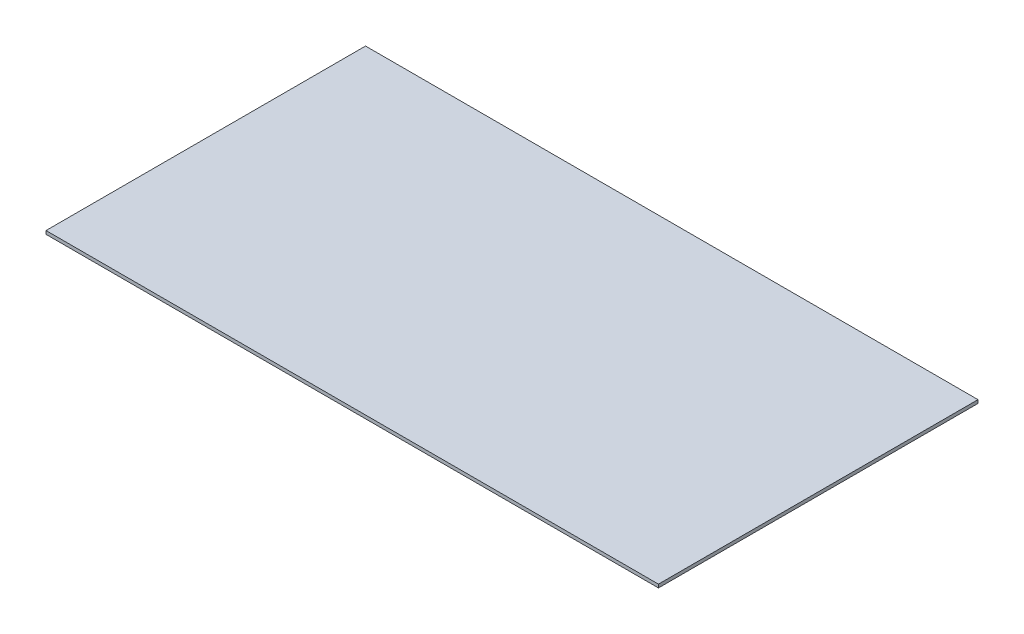
ISO-10303-21;
HEADER;
FILE_DESCRIPTION(('STEP AP214'),'2;1');
FILE_NAME('part.step','',(''),(''),'','','');
FILE_SCHEMA(('AUTOMOTIVE_DESIGN { 1 0 10303 214 1 1 1 1 }'));
ENDSEC;
DATA;
#1=APPLICATION_CONTEXT('core data for automotive mechanical design processes');
#2=APPLICATION_PROTOCOL_DEFINITION('international standard','automotive_design',2000,#1);
#3=PRODUCT_CONTEXT('',#1,'mechanical');
#4=PRODUCT('Part','Part','',(#3));
#5=PRODUCT_RELATED_PRODUCT_CATEGORY('part','',(#4));
#6=PRODUCT_DEFINITION_FORMATION('','',#4);
#7=PRODUCT_DEFINITION_CONTEXT('part definition',#1,'design');
#8=PRODUCT_DEFINITION('design','',#6,#7);
#9=PRODUCT_DEFINITION_SHAPE('','',#8);
#10=(LENGTH_UNIT() NAMED_UNIT(*) SI_UNIT(.MILLI.,.METRE.));
#11=(NAMED_UNIT(*) PLANE_ANGLE_UNIT() SI_UNIT($,.RADIAN.));
#12=(NAMED_UNIT(*) SI_UNIT($,.STERADIAN.) SOLID_ANGLE_UNIT());
#13=UNCERTAINTY_MEASURE_WITH_UNIT(LENGTH_MEASURE(1.E-05),#10,'distance_accuracy_value','');
#14=(GEOMETRIC_REPRESENTATION_CONTEXT(3) GLOBAL_UNCERTAINTY_ASSIGNED_CONTEXT((#13)) GLOBAL_UNIT_ASSIGNED_CONTEXT((#10,
#11,#12)) REPRESENTATION_CONTEXT('',''));
#15=CARTESIAN_POINT('',(0.,0.,0.));
#16=DIRECTION('',(0.,0.,1.));
#17=DIRECTION('',(1.,0.,0.));
#18=AXIS2_PLACEMENT_3D('',#15,#16,#17);
#19=CARTESIAN_POINT('',(584.2,6.35,304.8));
#20=DIRECTION('',(-1.,0.,0.));
#21=DIRECTION('',(0.,0.,1.));
#22=AXIS2_PLACEMENT_3D('',#19,#20,#21);
#23=PLANE('',#22);
#24=DIRECTION('',(0.,0.,-1.));
#25=VECTOR('',#24,1.);
#26=CARTESIAN_POINT('',(584.2,0.,304.8));
#27=LINE('',#26,#25);
#28=CARTESIAN_POINT('',(584.2,0.,304.8));
#29=VERTEX_POINT('',#28);
#30=CARTESIAN_POINT('',(584.2,0.,-304.8));
#31=VERTEX_POINT('',#30);
#32=EDGE_CURVE('E111',#29,#31,#27,.T.);
#33=ORIENTED_EDGE('',*,*,#32,.T.);
#34=DIRECTION('',(0.,-1.,0.));
#35=VECTOR('',#34,1.);
#36=CARTESIAN_POINT('',(584.2,6.35,-304.8));
#37=LINE('',#36,#35);
#38=CARTESIAN_POINT('',(584.2,6.35,-304.8));
#39=VERTEX_POINT('',#38);
#40=EDGE_CURVE('E11',#39,#31,#37,.T.);
#41=ORIENTED_EDGE('',*,*,#40,.F.);
#42=DIRECTION('',(0.,0.,-1.));
#43=VECTOR('',#42,1.);
#44=CARTESIAN_POINT('',(584.2,6.35,304.8));
#45=LINE('',#44,#43);
#46=CARTESIAN_POINT('',(584.2,6.35,304.8));
#47=VERTEX_POINT('',#46);
#48=EDGE_CURVE('E95',#47,#39,#45,.T.);
#49=ORIENTED_EDGE('',*,*,#48,.F.);
#50=DIRECTION('',(0.,-1.,0.));
#51=VECTOR('',#50,1.);
#52=CARTESIAN_POINT('',(584.2,6.35,304.8));
#53=LINE('',#52,#51);
#54=EDGE_CURVE('E107',#47,#29,#53,.T.);
#55=ORIENTED_EDGE('',*,*,#54,.T.);
#56=EDGE_LOOP('',(#33,#41,#49,#55));
#57=FACE_BOUND('',#56,.T.);
#58=ADVANCED_FACE('F43',(#57),#23,.F.);
#59=CARTESIAN_POINT('',(-584.2,6.35,-304.8));
#60=DIRECTION('',(0.,0.,1.));
#61=DIRECTION('',(1.,0.,0.));
#62=AXIS2_PLACEMENT_3D('',#59,#60,#61);
#63=PLANE('',#62);
#64=DIRECTION('',(-1.,0.,0.));
#65=VECTOR('',#64,1.);
#66=CARTESIAN_POINT('',(-584.2,0.,-304.8));
#67=LINE('',#66,#65);
#68=CARTESIAN_POINT('',(-584.2,0.,-304.8));
#69=VERTEX_POINT('',#68);
#70=EDGE_CURVE('E100',#31,#69,#67,.T.);
#71=ORIENTED_EDGE('',*,*,#70,.T.);
#72=DIRECTION('',(0.,-1.,0.));
#73=VECTOR('',#72,1.);
#74=CARTESIAN_POINT('',(-584.2,6.35,-304.8));
#75=LINE('',#74,#73);
#76=CARTESIAN_POINT('',(-584.2,6.35,-304.8));
#77=VERTEX_POINT('',#76);
#78=EDGE_CURVE('E52',#77,#69,#75,.T.);
#79=ORIENTED_EDGE('',*,*,#78,.F.);
#80=DIRECTION('',(-1.,0.,0.));
#81=VECTOR('',#80,1.);
#82=CARTESIAN_POINT('',(-584.2,6.35,-304.8));
#83=LINE('',#82,#81);
#84=EDGE_CURVE('E90',#39,#77,#83,.T.);
#85=ORIENTED_EDGE('',*,*,#84,.F.);
#86=ORIENTED_EDGE('',*,*,#40,.T.);
#87=EDGE_LOOP('',(#71,#79,#85,#86));
#88=FACE_BOUND('',#87,.T.);
#89=ADVANCED_FACE('F99',(#88),#63,.F.);
#90=CARTESIAN_POINT('',(-584.2,6.35,304.8));
#91=DIRECTION('',(1.,0.,0.));
#92=DIRECTION('',(0.,0.,-1.));
#93=AXIS2_PLACEMENT_3D('',#90,#91,#92);
#94=PLANE('',#93);
#95=DIRECTION('',(0.,0.,1.));
#96=VECTOR('',#95,1.);
#97=CARTESIAN_POINT('',(-584.2,0.,304.8));
#98=LINE('',#97,#96);
#99=CARTESIAN_POINT('',(-584.2,0.,304.8));
#100=VERTEX_POINT('',#99);
#101=EDGE_CURVE('E77',#69,#100,#98,.T.);
#102=ORIENTED_EDGE('',*,*,#101,.T.);
#103=DIRECTION('',(0.,-1.,0.));
#104=VECTOR('',#103,1.);
#105=CARTESIAN_POINT('',(-584.2,6.35,304.8));
#106=LINE('',#105,#104);
#107=CARTESIAN_POINT('',(-584.2,6.35,304.8));
#108=VERTEX_POINT('',#107);
#109=EDGE_CURVE('E102',#108,#100,#106,.T.);
#110=ORIENTED_EDGE('',*,*,#109,.F.);
#111=DIRECTION('',(0.,0.,1.));
#112=VECTOR('',#111,1.);
#113=CARTESIAN_POINT('',(-584.2,6.35,304.8));
#114=LINE('',#113,#112);
#115=EDGE_CURVE('E93',#77,#108,#114,.T.);
#116=ORIENTED_EDGE('',*,*,#115,.F.);
#117=ORIENTED_EDGE('',*,*,#78,.T.);
#118=EDGE_LOOP('',(#102,#110,#116,#117));
#119=FACE_BOUND('',#118,.T.);
#120=ADVANCED_FACE('F103',(#119),#94,.F.);
#121=CARTESIAN_POINT('',(-584.2,6.35,304.8));
#122=DIRECTION('',(0.,0.,-1.));
#123=DIRECTION('',(-1.,0.,0.));
#124=AXIS2_PLACEMENT_3D('',#121,#122,#123);
#125=PLANE('',#124);
#126=DIRECTION('',(1.,0.,0.));
#127=VECTOR('',#126,1.);
#128=CARTESIAN_POINT('',(-584.2,0.,304.8));
#129=LINE('',#128,#127);
#130=EDGE_CURVE('E83',#100,#29,#129,.T.);
#131=ORIENTED_EDGE('',*,*,#130,.T.);
#132=ORIENTED_EDGE('',*,*,#54,.F.);
#133=DIRECTION('',(1.,0.,0.));
#134=VECTOR('',#133,1.);
#135=CARTESIAN_POINT('',(-584.2,6.35,304.8));
#136=LINE('',#135,#134);
#137=EDGE_CURVE('E60',#108,#47,#136,.T.);
#138=ORIENTED_EDGE('',*,*,#137,.F.);
#139=ORIENTED_EDGE('',*,*,#109,.T.);
#140=EDGE_LOOP('',(#131,#132,#138,#139));
#141=FACE_BOUND('',#140,.T.);
#142=ADVANCED_FACE('F124',(#141),#125,.F.);
#143=CARTESIAN_POINT('',(0.,6.35,0.));
#144=DIRECTION('',(0.,-1.,0.));
#145=DIRECTION('',(0.,0.,-1.));
#146=AXIS2_PLACEMENT_3D('',#143,#144,#145);
#147=PLANE('',#146);
#148=ORIENTED_EDGE('',*,*,#48,.T.);
#149=ORIENTED_EDGE('',*,*,#84,.T.);
#150=ORIENTED_EDGE('',*,*,#115,.T.);
#151=ORIENTED_EDGE('',*,*,#137,.T.);
#152=EDGE_LOOP('',(#148,#149,#150,#151));
#153=FACE_BOUND('',#152,.T.);
#154=ADVANCED_FACE('F91',(#153),#147,.F.);
#155=CARTESIAN_POINT('',(0.,0.,0.));
#156=DIRECTION('',(0.,-1.,0.));
#157=DIRECTION('',(0.,0.,-1.));
#158=AXIS2_PLACEMENT_3D('',#155,#156,#157);
#159=PLANE('',#158);
#160=ORIENTED_EDGE('',*,*,#32,.F.);
#161=ORIENTED_EDGE('',*,*,#130,.F.);
#162=ORIENTED_EDGE('',*,*,#101,.F.);
#163=ORIENTED_EDGE('',*,*,#70,.F.);
#164=EDGE_LOOP('',(#160,#161,#162,#163));
#165=FACE_BOUND('',#164,.T.);
#166=ADVANCED_FACE('F127',(#165),#159,.T.);
#167=CLOSED_SHELL('',(#58,#89,#120,#142,#154,#166));
#168=MANIFOLD_SOLID_BREP('B2',#167);
#169=ADVANCED_BREP_SHAPE_REPRESENTATION('',(#18,#168),#14);
#170=SHAPE_DEFINITION_REPRESENTATION(#9,#169);
ENDSEC;
END-ISO-10303-21;
